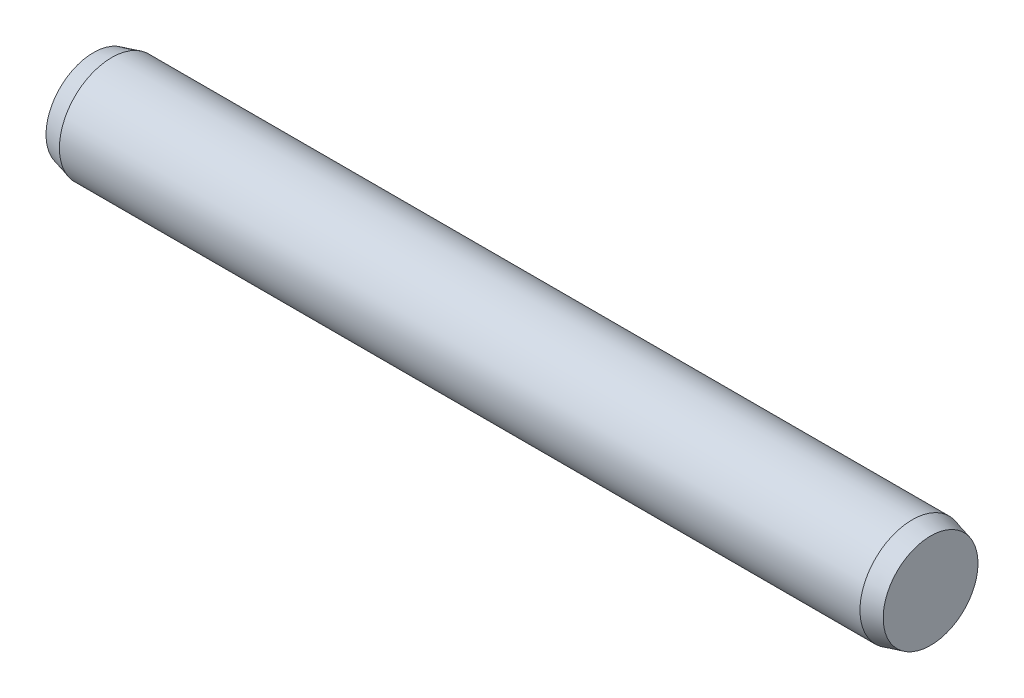
ISO-10303-21;
HEADER;
FILE_DESCRIPTION(('STEP AP214'),'2;1');
FILE_NAME('part.step','',(''),(''),'','','');
FILE_SCHEMA(('AUTOMOTIVE_DESIGN { 1 0 10303 214 1 1 1 1 }'));
ENDSEC;
DATA;
#1=APPLICATION_CONTEXT('core data for automotive mechanical design processes');
#2=APPLICATION_PROTOCOL_DEFINITION('international standard','automotive_design',2000,#1);
#3=PRODUCT_CONTEXT('',#1,'mechanical');
#4=PRODUCT('Part','Part','',(#3));
#5=PRODUCT_RELATED_PRODUCT_CATEGORY('part','',(#4));
#6=PRODUCT_DEFINITION_FORMATION('','',#4);
#7=PRODUCT_DEFINITION_CONTEXT('part definition',#1,'design');
#8=PRODUCT_DEFINITION('design','',#6,#7);
#9=PRODUCT_DEFINITION_SHAPE('','',#8);
#10=(LENGTH_UNIT() NAMED_UNIT(*) SI_UNIT(.MILLI.,.METRE.));
#11=(NAMED_UNIT(*) PLANE_ANGLE_UNIT() SI_UNIT($,.RADIAN.));
#12=(NAMED_UNIT(*) SI_UNIT($,.STERADIAN.) SOLID_ANGLE_UNIT());
#13=UNCERTAINTY_MEASURE_WITH_UNIT(LENGTH_MEASURE(1.E-05),#10,'distance_accuracy_value','');
#14=(GEOMETRIC_REPRESENTATION_CONTEXT(3) GLOBAL_UNCERTAINTY_ASSIGNED_CONTEXT((#13)) GLOBAL_UNIT_ASSIGNED_CONTEXT((#10,
#11,#12)) REPRESENTATION_CONTEXT('',''));
#15=CARTESIAN_POINT('',(0.,0.,0.));
#16=DIRECTION('',(0.,0.,1.));
#17=DIRECTION('',(1.,0.,0.));
#18=AXIS2_PLACEMENT_3D('',#15,#16,#17);
#19=CARTESIAN_POINT('',(-7.65,0.,0.));
#20=DIRECTION('',(1.,0.,0.));
#21=DIRECTION('',(0.,0.,-1.));
#22=AXIS2_PLACEMENT_3D('',#19,#20,#21);
#23=CYLINDRICAL_SURFACE('',#22,1.);
#24=CARTESIAN_POINT('',(-7.65,0.,0.));
#25=DIRECTION('',(-1.,0.,0.));
#26=DIRECTION('',(0.,0.,1.));
#27=AXIS2_PLACEMENT_3D('',#24,#25,#26);
#28=CIRCLE('',#27,1.);
#29=CARTESIAN_POINT('',(-7.65,0.,-1.));
#30=VERTEX_POINT('',#29);
#31=EDGE_CURVE('E44',#30,#30,#28,.T.);
#32=CARTESIAN_POINT('',(7.65,0.,0.));
#33=DIRECTION('',(1.,0.,0.));
#34=DIRECTION('',(0.,0.,-1.));
#35=AXIS2_PLACEMENT_3D('',#32,#33,#34);
#36=CIRCLE('',#35,1.);
#37=CARTESIAN_POINT('',(7.65,0.,-1.));
#38=VERTEX_POINT('',#37);
#39=EDGE_CURVE('E10',#38,#38,#36,.T.);
#40=CARTESIAN_POINT('',(-7.65,0.,-1.));
#41=CARTESIAN_POINT('',(-7.490625,0.,-1.));
#42=CARTESIAN_POINT('',(-7.33125,0.,-1.));
#43=CARTESIAN_POINT('',(-7.0125,0.,-1.));
#44=CARTESIAN_POINT('',(-6.853125,0.,-1.));
#45=CARTESIAN_POINT('',(-6.534375,0.,-1.));
#46=CARTESIAN_POINT('',(-6.375,0.,-1.));
#47=CARTESIAN_POINT('',(-6.05625,0.,-1.));
#48=CARTESIAN_POINT('',(-5.896875,0.,-1.));
#49=CARTESIAN_POINT('',(-5.578125,0.,-1.));
#50=CARTESIAN_POINT('',(-5.41875,0.,-1.));
#51=CARTESIAN_POINT('',(-5.1,0.,-1.));
#52=CARTESIAN_POINT('',(-4.940625,0.,-1.));
#53=CARTESIAN_POINT('',(-4.621875,0.,-1.));
#54=CARTESIAN_POINT('',(-4.4625,0.,-1.));
#55=CARTESIAN_POINT('',(-4.14375,0.,-1.));
#56=CARTESIAN_POINT('',(-3.984375,0.,-1.));
#57=CARTESIAN_POINT('',(-3.665625,0.,-1.));
#58=CARTESIAN_POINT('',(-3.50625,0.,-1.));
#59=CARTESIAN_POINT('',(-3.1875,0.,-1.));
#60=CARTESIAN_POINT('',(-3.028125,0.,-1.));
#61=CARTESIAN_POINT('',(-2.709375,0.,-1.));
#62=CARTESIAN_POINT('',(-2.55,0.,-1.));
#63=CARTESIAN_POINT('',(-2.23125,0.,-1.));
#64=CARTESIAN_POINT('',(-2.071875,0.,-1.));
#65=CARTESIAN_POINT('',(-1.753125,0.,-1.));
#66=CARTESIAN_POINT('',(-1.59375,0.,-1.));
#67=CARTESIAN_POINT('',(-1.275,0.,-1.));
#68=CARTESIAN_POINT('',(-1.115625,0.,-1.));
#69=CARTESIAN_POINT('',(-0.796875,0.,-1.));
#70=CARTESIAN_POINT('',(-0.637500000000001,0.,-1.));
#71=CARTESIAN_POINT('',(-0.31875,0.,-1.));
#72=CARTESIAN_POINT('',(-0.159375,0.,-1.));
#73=CARTESIAN_POINT('',(0.159374999999999,0.,-1.));
#74=CARTESIAN_POINT('',(0.318749999999999,0.,-1.));
#75=CARTESIAN_POINT('',(0.637499999999999,0.,-1.));
#76=CARTESIAN_POINT('',(0.796874999999999,0.,-1.));
#77=CARTESIAN_POINT('',(1.115625,0.,-1.));
#78=CARTESIAN_POINT('',(1.275,0.,-1.));
#79=CARTESIAN_POINT('',(1.59375,0.,-1.));
#80=CARTESIAN_POINT('',(1.753125,0.,-1.));
#81=CARTESIAN_POINT('',(2.071875,0.,-1.));
#82=CARTESIAN_POINT('',(2.23125,0.,-1.));
#83=CARTESIAN_POINT('',(2.55,0.,-1.));
#84=CARTESIAN_POINT('',(2.709375,0.,-1.));
#85=CARTESIAN_POINT('',(3.028125,0.,-1.));
#86=CARTESIAN_POINT('',(3.1875,0.,-1.));
#87=CARTESIAN_POINT('',(3.50625,0.,-1.));
#88=CARTESIAN_POINT('',(3.665625,0.,-1.));
#89=CARTESIAN_POINT('',(3.984375,0.,-1.));
#90=CARTESIAN_POINT('',(4.14375,0.,-1.));
#91=CARTESIAN_POINT('',(4.4625,0.,-1.));
#92=CARTESIAN_POINT('',(4.621875,0.,-1.));
#93=CARTESIAN_POINT('',(4.940625,0.,-1.));
#94=CARTESIAN_POINT('',(5.1,0.,-1.));
#95=CARTESIAN_POINT('',(5.41875,0.,-1.));
#96=CARTESIAN_POINT('',(5.578125,0.,-1.));
#97=CARTESIAN_POINT('',(5.896875,0.,-1.));
#98=CARTESIAN_POINT('',(6.05625,0.,-1.));
#99=CARTESIAN_POINT('',(6.375,0.,-1.));
#100=CARTESIAN_POINT('',(6.534375,0.,-1.));
#101=CARTESIAN_POINT('',(6.853125,0.,-1.));
#102=CARTESIAN_POINT('',(7.0125,0.,-1.));
#103=CARTESIAN_POINT('',(7.33125,0.,-1.));
#104=CARTESIAN_POINT('',(7.490625,0.,-1.));
#105=CARTESIAN_POINT('',(7.65,0.,-1.));
#106=B_SPLINE_CURVE_WITH_KNOTS('',3,(#40,#41,#42,#43,#44,#45,#46,#47,#48,#49,#50,#51,#52,#53,
#54,#55,#56,#57,#58,#59,#60,#61,#62,#63,#64,#65,#66,#67,#68,#69,#70,#71,#72,#73,#74,#75,#76,#77,
#78,#79,#80,#81,#82,#83,#84,#85,#86,#87,#88,#89,#90,#91,#92,#93,#94,#95,#96,#97,#98,#99,#100,
#101,#102,#103,#104,#105),.UNSPECIFIED.,.F.,.F.,(4,2,2,2,2,2,2,2,2,2,2,2,2,2,2,2,2,2,2,2,2,2,2,
2,2,2,2,2,2,2,2,2,4),(0.,0.478125,0.95625,1.434375,1.9125,2.390625,2.86875,3.346875,3.825,
4.303125,4.78125,5.259375,5.7375,6.215625,6.69375,7.171875,7.65,8.128125,8.60625,9.084375,
9.5625,10.040625,10.51875,10.996875,11.475,11.953125,12.43125,12.909375,13.3875,13.865625,
14.34375,14.821875,15.3),.UNSPECIFIED.);
#107=EDGE_CURVE('BSEAM30',#30,#38,#106,.T.);
#108=ORIENTED_EDGE('',*,*,#31,.F.);
#109=ORIENTED_EDGE('',*,*,#39,.F.);
#110=ORIENTED_EDGE('',*,*,#107,.T.);
#111=ORIENTED_EDGE('',*,*,#107,.F.);
#112=EDGE_LOOP('',(#108,#110,#109,#111));
#113=FACE_BOUND('',#112,.T.);
#114=ADVANCED_FACE('F30',(#113),#23,.T.);
#115=CARTESIAN_POINT('',(7.65,0.,0.));
#116=DIRECTION('',(-1.,0.,0.));
#117=DIRECTION('',(0.,0.,-1.));
#118=AXIS2_PLACEMENT_3D('',#115,#116,#117);
#119=CONICAL_SURFACE('',#118,1.,0.26179938779915);
#120=CARTESIAN_POINT('',(8.,0.,0.));
#121=DIRECTION('',(1.,0.,0.));
#122=DIRECTION('',(0.,0.,-1.));
#123=AXIS2_PLACEMENT_3D('',#120,#121,#122);
#124=CIRCLE('',#123,0.906217782649108);
#125=CARTESIAN_POINT('',(8.,0.,-0.906217782649108));
#126=VERTEX_POINT('',#125);
#127=EDGE_CURVE('E36',#126,#126,#124,.T.);
#128=ORIENTED_EDGE('',*,*,#127,.F.);
#129=EDGE_LOOP('',(#128));
#130=FACE_BOUND('',#129,.T.);
#131=ORIENTED_EDGE('',*,*,#39,.T.);
#132=EDGE_LOOP('',(#131));
#133=FACE_BOUND('',#132,.T.);
#134=ADVANCED_FACE('F54',(#130,#133),#119,.T.);
#135=CARTESIAN_POINT('',(8.,0.,0.));
#136=DIRECTION('',(1.,0.,0.));
#137=DIRECTION('',(0.,0.,-1.));
#138=AXIS2_PLACEMENT_3D('',#135,#136,#137);
#139=PLANE('',#138);
#140=ORIENTED_EDGE('',*,*,#127,.T.);
#141=EDGE_LOOP('',(#140));
#142=FACE_BOUND('',#141,.T.);
#143=ADVANCED_FACE('F58',(#142),#139,.T.);
#144=CARTESIAN_POINT('',(-7.65,0.,0.));
#145=DIRECTION('',(1.,0.,0.));
#146=DIRECTION('',(0.,0.,1.));
#147=AXIS2_PLACEMENT_3D('',#144,#145,#146);
#148=CONICAL_SURFACE('',#147,1.,0.26179938779915);
#149=CARTESIAN_POINT('',(-8.,0.,0.));
#150=DIRECTION('',(-1.,0.,0.));
#151=DIRECTION('',(0.,0.,1.));
#152=AXIS2_PLACEMENT_3D('',#149,#150,#151);
#153=CIRCLE('',#152,0.906217782649108);
#154=CARTESIAN_POINT('',(-8.,0.,0.906217782649108));
#155=VERTEX_POINT('',#154);
#156=EDGE_CURVE('E40',#155,#155,#153,.T.);
#157=ORIENTED_EDGE('',*,*,#156,.F.);
#158=EDGE_LOOP('',(#157));
#159=FACE_BOUND('',#158,.T.);
#160=ORIENTED_EDGE('',*,*,#31,.T.);
#161=EDGE_LOOP('',(#160));
#162=FACE_BOUND('',#161,.T.);
#163=ADVANCED_FACE('F50',(#159,#162),#148,.T.);
#164=CARTESIAN_POINT('',(-8.,0.,0.));
#165=DIRECTION('',(-1.,0.,0.));
#166=DIRECTION('',(0.,0.,1.));
#167=AXIS2_PLACEMENT_3D('',#164,#165,#166);
#168=PLANE('',#167);
#169=ORIENTED_EDGE('',*,*,#156,.T.);
#170=EDGE_LOOP('',(#169));
#171=FACE_BOUND('',#170,.T.);
#172=ADVANCED_FACE('F67',(#171),#168,.T.);
#173=CLOSED_SHELL('',(#114,#134,#143,#163,#172));
#174=MANIFOLD_SOLID_BREP('B2',#173);
#175=ADVANCED_BREP_SHAPE_REPRESENTATION('',(#18,#174),#14);
#176=SHAPE_DEFINITION_REPRESENTATION(#9,#175);
ENDSEC;
END-ISO-10303-21;
